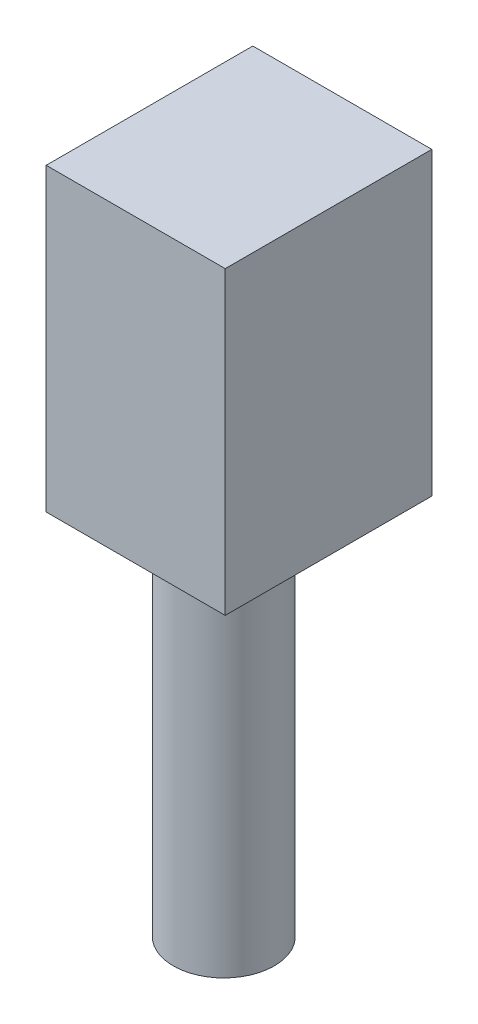
ISO-10303-21;
HEADER;
FILE_DESCRIPTION(('STEP AP214'),'2;1');
FILE_NAME('part.step','',(''),(''),'','','');
FILE_SCHEMA(('AUTOMOTIVE_DESIGN { 1 0 10303 214 1 1 1 1 }'));
ENDSEC;
DATA;
#1=APPLICATION_CONTEXT('core data for automotive mechanical design processes');
#2=APPLICATION_PROTOCOL_DEFINITION('international standard','automotive_design',2000,#1);
#3=PRODUCT_CONTEXT('',#1,'mechanical');
#4=PRODUCT('Part','Part','',(#3));
#5=PRODUCT_RELATED_PRODUCT_CATEGORY('part','',(#4));
#6=PRODUCT_DEFINITION_FORMATION('','',#4);
#7=PRODUCT_DEFINITION_CONTEXT('part definition',#1,'design');
#8=PRODUCT_DEFINITION('design','',#6,#7);
#9=PRODUCT_DEFINITION_SHAPE('','',#8);
#10=(LENGTH_UNIT() NAMED_UNIT(*) SI_UNIT(.MILLI.,.METRE.));
#11=(NAMED_UNIT(*) PLANE_ANGLE_UNIT() SI_UNIT($,.RADIAN.));
#12=(NAMED_UNIT(*) SI_UNIT($,.STERADIAN.) SOLID_ANGLE_UNIT());
#13=UNCERTAINTY_MEASURE_WITH_UNIT(LENGTH_MEASURE(1.E-05),#10,'distance_accuracy_value','');
#14=(GEOMETRIC_REPRESENTATION_CONTEXT(3) GLOBAL_UNCERTAINTY_ASSIGNED_CONTEXT((#13)) GLOBAL_UNIT_ASSIGNED_CONTEXT((#10,
#11,#12)) REPRESENTATION_CONTEXT('',''));
#15=CARTESIAN_POINT('',(0.,0.,0.));
#16=DIRECTION('',(0.,0.,1.));
#17=DIRECTION('',(1.,0.,0.));
#18=AXIS2_PLACEMENT_3D('',#15,#16,#17);
#19=CARTESIAN_POINT('',(-51.3417655127895,0.,-95.0396517388848));
#20=DIRECTION('',(0.,-1.,0.));
#21=DIRECTION('',(0.,0.,-1.));
#22=AXIS2_PLACEMENT_3D('',#19,#20,#21);
#23=PLANE('',#22);
#24=DIRECTION('',(0.,0.,1.));
#25=VECTOR('',#24,1.);
#26=CARTESIAN_POINT('',(-51.3417655127895,0.,47.7083482611151));
#27=LINE('',#26,#25);
#28=CARTESIAN_POINT('',(-51.3417655127895,0.,-95.0396517388848));
#29=VERTEX_POINT('',#28);
#30=CARTESIAN_POINT('',(-51.3417655127895,0.,47.7083482611151));
#31=VERTEX_POINT('',#30);
#32=EDGE_CURVE('E95',#29,#31,#27,.T.);
#33=ORIENTED_EDGE('',*,*,#32,.F.);
#34=DIRECTION('',(-1.,0.,0.));
#35=VECTOR('',#34,1.);
#36=CARTESIAN_POINT('',(-51.3417655127895,0.,-95.0396517388848));
#37=LINE('',#36,#35);
#38=CARTESIAN_POINT('',(72.3562344872105,0.,-95.0396517388848));
#39=VERTEX_POINT('',#38);
#40=EDGE_CURVE('E71',#39,#29,#37,.T.);
#41=ORIENTED_EDGE('',*,*,#40,.F.);
#42=DIRECTION('',(0.,0.,-1.));
#43=VECTOR('',#42,1.);
#44=CARTESIAN_POINT('',(72.3562344872105,0.,47.7083482611151));
#45=LINE('',#44,#43);
#46=CARTESIAN_POINT('',(72.3562344872105,0.,47.7083482611151));
#47=VERTEX_POINT('',#46);
#48=EDGE_CURVE('E65',#47,#39,#45,.T.);
#49=ORIENTED_EDGE('',*,*,#48,.F.);
#50=DIRECTION('',(1.,0.,0.));
#51=VECTOR('',#50,1.);
#52=CARTESIAN_POINT('',(-51.3417655127895,0.,47.7083482611151));
#53=LINE('',#52,#51);
#54=EDGE_CURVE('E87',#31,#47,#53,.T.);
#55=ORIENTED_EDGE('',*,*,#54,.F.);
#56=EDGE_LOOP('',(#33,#41,#49,#55));
#57=FACE_BOUND('',#56,.T.);
#58=CARTESIAN_POINT('',(0.,0.,-23.6656517388849));
#59=DIRECTION('',(0.,-1.,0.));
#60=DIRECTION('',(0.,0.,-1.));
#61=AXIS2_PLACEMENT_3D('',#58,#59,#60);
#62=CIRCLE('',#61,34.925);
#63=CARTESIAN_POINT('',(0.,0.,-58.5906517388849));
#64=VERTEX_POINT('',#63);
#65=EDGE_CURVE('E109',#64,#64,#62,.T.);
#66=ORIENTED_EDGE('',*,*,#65,.F.);
#67=EDGE_LOOP('',(#66));
#68=FACE_BOUND('',#67,.T.);
#69=ADVANCED_FACE('F31',(#57,#68),#23,.T.);
#70=CARTESIAN_POINT('',(-51.3417655127895,207.518,47.7083482611151));
#71=DIRECTION('',(1.,0.,0.));
#72=DIRECTION('',(0.,0.,-1.));
#73=AXIS2_PLACEMENT_3D('',#70,#71,#72);
#74=PLANE('',#73);
#75=ORIENTED_EDGE('',*,*,#32,.T.);
#76=DIRECTION('',(0.,-1.,0.));
#77=VECTOR('',#76,1.);
#78=CARTESIAN_POINT('',(-51.3417655127895,207.518,47.7083482611151));
#79=LINE('',#78,#77);
#80=CARTESIAN_POINT('',(-51.3417655127895,207.518,47.7083482611151));
#81=VERTEX_POINT('',#80);
#82=EDGE_CURVE('E11',#81,#31,#79,.T.);
#83=ORIENTED_EDGE('',*,*,#82,.F.);
#84=DIRECTION('',(0.,0.,1.));
#85=VECTOR('',#84,1.);
#86=CARTESIAN_POINT('',(-51.3417655127895,207.518,47.7083482611151));
#87=LINE('',#86,#85);
#88=CARTESIAN_POINT('',(-51.3417655127895,207.518,-95.0396517388848));
#89=VERTEX_POINT('',#88);
#90=EDGE_CURVE('E83',#89,#81,#87,.T.);
#91=ORIENTED_EDGE('',*,*,#90,.F.);
#92=DIRECTION('',(0.,-1.,0.));
#93=VECTOR('',#92,1.);
#94=CARTESIAN_POINT('',(-51.3417655127895,207.518,-95.0396517388848));
#95=LINE('',#94,#93);
#96=EDGE_CURVE('E91',#89,#29,#95,.T.);
#97=ORIENTED_EDGE('',*,*,#96,.T.);
#98=EDGE_LOOP('',(#75,#83,#91,#97));
#99=FACE_BOUND('',#98,.T.);
#100=ADVANCED_FACE('F33',(#99),#74,.F.);
#101=CARTESIAN_POINT('',(-51.3417655127895,207.518,47.7083482611151));
#102=DIRECTION('',(0.,0.,-1.));
#103=DIRECTION('',(-1.,0.,0.));
#104=AXIS2_PLACEMENT_3D('',#101,#102,#103);
#105=PLANE('',#104);
#106=ORIENTED_EDGE('',*,*,#54,.T.);
#107=DIRECTION('',(0.,-1.,0.));
#108=VECTOR('',#107,1.);
#109=CARTESIAN_POINT('',(72.3562344872105,207.518,47.7083482611151));
#110=LINE('',#109,#108);
#111=CARTESIAN_POINT('',(72.3562344872105,207.518,47.7083482611151));
#112=VERTEX_POINT('',#111);
#113=EDGE_CURVE('E40',#112,#47,#110,.T.);
#114=ORIENTED_EDGE('',*,*,#113,.F.);
#115=DIRECTION('',(1.,0.,0.));
#116=VECTOR('',#115,1.);
#117=CARTESIAN_POINT('',(-51.3417655127895,207.518,47.7083482611151));
#118=LINE('',#117,#116);
#119=EDGE_CURVE('E78',#81,#112,#118,.T.);
#120=ORIENTED_EDGE('',*,*,#119,.F.);
#121=ORIENTED_EDGE('',*,*,#82,.T.);
#122=EDGE_LOOP('',(#106,#114,#120,#121));
#123=FACE_BOUND('',#122,.T.);
#124=ADVANCED_FACE('F86',(#123),#105,.F.);
#125=CARTESIAN_POINT('',(72.3562344872105,207.518,47.7083482611151));
#126=DIRECTION('',(-1.,0.,0.));
#127=DIRECTION('',(0.,0.,1.));
#128=AXIS2_PLACEMENT_3D('',#125,#126,#127);
#129=PLANE('',#128);
#130=ORIENTED_EDGE('',*,*,#48,.T.);
#131=DIRECTION('',(0.,-1.,0.));
#132=VECTOR('',#131,1.);
#133=CARTESIAN_POINT('',(72.3562344872105,207.518,-95.0396517388848));
#134=LINE('',#133,#132);
#135=CARTESIAN_POINT('',(72.3562344872105,207.518,-95.0396517388848));
#136=VERTEX_POINT('',#135);
#137=EDGE_CURVE('E88',#136,#39,#134,.T.);
#138=ORIENTED_EDGE('',*,*,#137,.F.);
#139=DIRECTION('',(0.,0.,-1.));
#140=VECTOR('',#139,1.);
#141=CARTESIAN_POINT('',(72.3562344872105,207.518,47.7083482611151));
#142=LINE('',#141,#140);
#143=EDGE_CURVE('E81',#112,#136,#142,.T.);
#144=ORIENTED_EDGE('',*,*,#143,.F.);
#145=ORIENTED_EDGE('',*,*,#113,.T.);
#146=EDGE_LOOP('',(#130,#138,#144,#145));
#147=FACE_BOUND('',#146,.T.);
#148=ADVANCED_FACE('F89',(#147),#129,.F.);
#149=CARTESIAN_POINT('',(-51.3417655127895,207.518,-95.0396517388848));
#150=DIRECTION('',(0.,0.,1.));
#151=DIRECTION('',(1.,0.,0.));
#152=AXIS2_PLACEMENT_3D('',#149,#150,#151);
#153=PLANE('',#152);
#154=ORIENTED_EDGE('',*,*,#40,.T.);
#155=ORIENTED_EDGE('',*,*,#96,.F.);
#156=DIRECTION('',(-1.,0.,0.));
#157=VECTOR('',#156,1.);
#158=CARTESIAN_POINT('',(-51.3417655127895,207.518,-95.0396517388848));
#159=LINE('',#158,#157);
#160=EDGE_CURVE('E48',#136,#89,#159,.T.);
#161=ORIENTED_EDGE('',*,*,#160,.F.);
#162=ORIENTED_EDGE('',*,*,#137,.T.);
#163=EDGE_LOOP('',(#154,#155,#161,#162));
#164=FACE_BOUND('',#163,.T.);
#165=ADVANCED_FACE('F103',(#164),#153,.F.);
#166=CARTESIAN_POINT('',(-51.3417655127895,207.518,-95.0396517388848));
#167=DIRECTION('',(0.,-1.,0.));
#168=DIRECTION('',(0.,0.,-1.));
#169=AXIS2_PLACEMENT_3D('',#166,#167,#168);
#170=PLANE('',#169);
#171=ORIENTED_EDGE('',*,*,#90,.T.);
#172=ORIENTED_EDGE('',*,*,#119,.T.);
#173=ORIENTED_EDGE('',*,*,#143,.T.);
#174=ORIENTED_EDGE('',*,*,#160,.T.);
#175=EDGE_LOOP('',(#171,#172,#173,#174));
#176=FACE_BOUND('',#175,.T.);
#177=ADVANCED_FACE('F79',(#176),#170,.F.);
#178=CARTESIAN_POINT('',(0.,-264.16,-23.6656517388849));
#179=DIRECTION('',(0.,1.,0.));
#180=DIRECTION('',(0.,0.,1.));
#181=AXIS2_PLACEMENT_3D('',#178,#179,#180);
#182=CYLINDRICAL_SURFACE('',#181,34.925);
#183=CARTESIAN_POINT('',(0.,-264.16,-23.6656517388849));
#184=DIRECTION('',(0.,-1.,0.));
#185=DIRECTION('',(0.,0.,-1.));
#186=AXIS2_PLACEMENT_3D('',#183,#184,#185);
#187=CIRCLE('',#186,34.925);
#188=CARTESIAN_POINT('',(0.,-264.16,-58.5906517388849));
#189=VERTEX_POINT('',#188);
#190=EDGE_CURVE('E98',#189,#189,#187,.T.);
#191=ORIENTED_EDGE('',*,*,#190,.F.);
#192=EDGE_LOOP('',(#191));
#193=FACE_BOUND('',#192,.T.);
#194=ORIENTED_EDGE('',*,*,#65,.T.);
#195=EDGE_LOOP('',(#194));
#196=FACE_BOUND('',#195,.T.);
#197=ADVANCED_FACE('F117',(#193,#196),#182,.T.);
#198=CARTESIAN_POINT('',(0.,-264.16,-23.6656517388849));
#199=DIRECTION('',(0.,-1.,0.));
#200=DIRECTION('',(0.,0.,-1.));
#201=AXIS2_PLACEMENT_3D('',#198,#199,#200);
#202=PLANE('',#201);
#203=ORIENTED_EDGE('',*,*,#190,.T.);
#204=EDGE_LOOP('',(#203));
#205=FACE_BOUND('',#204,.T.);
#206=ADVANCED_FACE('F115',(#205),#202,.T.);
#207=CLOSED_SHELL('',(#69,#100,#124,#148,#165,#177,#197,#206));
#208=MANIFOLD_SOLID_BREP('B2',#207);
#209=ADVANCED_BREP_SHAPE_REPRESENTATION('',(#18,#208),#14);
#210=SHAPE_DEFINITION_REPRESENTATION(#9,#209);
ENDSEC;
END-ISO-10303-21;
